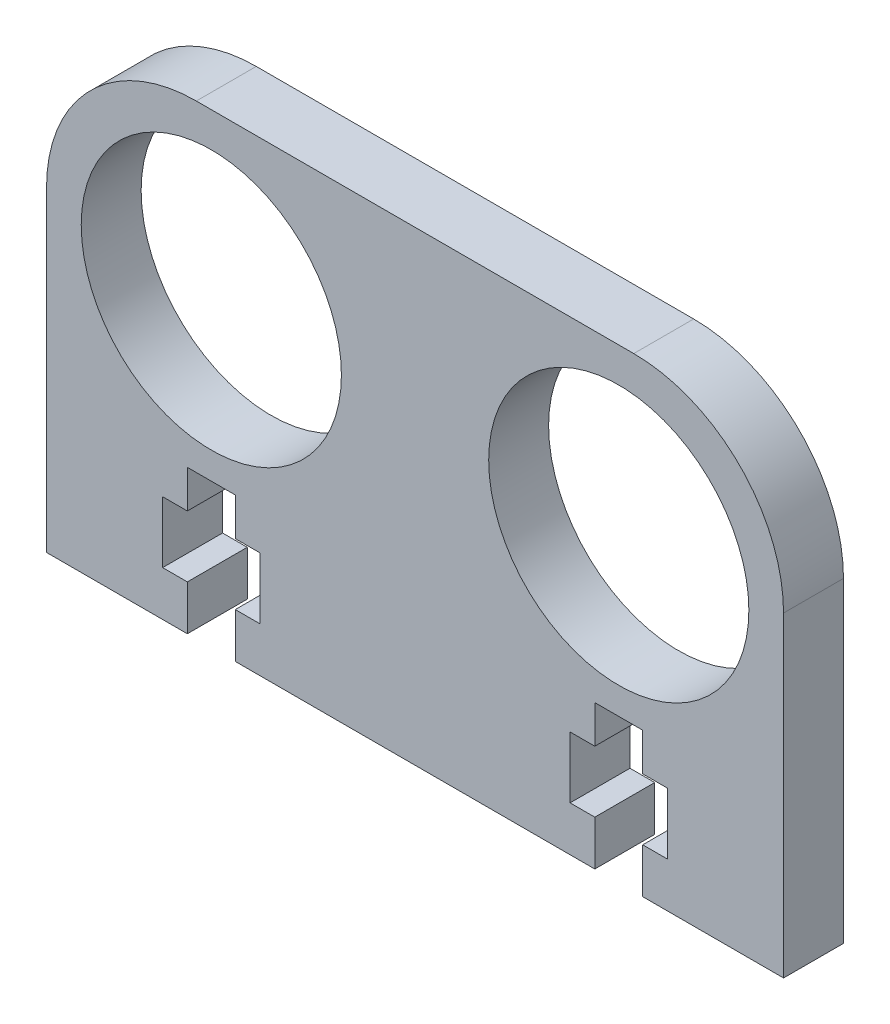
ISO-10303-21;
HEADER;
FILE_DESCRIPTION(('STEP AP214'),'2;1');
FILE_NAME('part.step','',(''),(''),'','','');
FILE_SCHEMA(('AUTOMOTIVE_DESIGN { 1 0 10303 214 1 1 1 1 }'));
ENDSEC;
DATA;
#1=APPLICATION_CONTEXT('core data for automotive mechanical design processes');
#2=APPLICATION_PROTOCOL_DEFINITION('international standard','automotive_design',2000,#1);
#3=PRODUCT_CONTEXT('',#1,'mechanical');
#4=PRODUCT('Part','Part','',(#3));
#5=PRODUCT_RELATED_PRODUCT_CATEGORY('part','',(#4));
#6=PRODUCT_DEFINITION_FORMATION('','',#4);
#7=PRODUCT_DEFINITION_CONTEXT('part definition',#1,'design');
#8=PRODUCT_DEFINITION('design','',#6,#7);
#9=PRODUCT_DEFINITION_SHAPE('','',#8);
#10=(LENGTH_UNIT() NAMED_UNIT(*) SI_UNIT(.MILLI.,.METRE.));
#11=(NAMED_UNIT(*) PLANE_ANGLE_UNIT() SI_UNIT($,.RADIAN.));
#12=(NAMED_UNIT(*) SI_UNIT($,.STERADIAN.) SOLID_ANGLE_UNIT());
#13=UNCERTAINTY_MEASURE_WITH_UNIT(LENGTH_MEASURE(1.E-05),#10,'distance_accuracy_value','');
#14=(GEOMETRIC_REPRESENTATION_CONTEXT(3) GLOBAL_UNCERTAINTY_ASSIGNED_CONTEXT((#13)) GLOBAL_UNIT_ASSIGNED_CONTEXT((#10,
#11,#12)) REPRESENTATION_CONTEXT('',''));
#15=CARTESIAN_POINT('',(0.,0.,0.));
#16=DIRECTION('',(0.,0.,1.));
#17=DIRECTION('',(1.,0.,0.));
#18=AXIS2_PLACEMENT_3D('',#15,#16,#17);
#19=CARTESIAN_POINT('',(0.0400000000000001,11.1479248788774,3.9));
#20=DIRECTION('',(0.,-1.,0.));
#21=DIRECTION('',(1.,0.,0.));
#22=AXIS2_PLACEMENT_3D('',#19,#20,#21);
#23=PLANE('',#22);
#24=DIRECTION('',(-1.,0.,0.));
#25=VECTOR('',#24,1.);
#26=CARTESIAN_POINT('',(0.0400000000000001,11.1479248788774,0.0999999999999999));
#27=LINE('',#26,#25);
#28=CARTESIAN_POINT('',(14.6699999999999,11.1479248788774,0.0999999999999999));
#29=VERTEX_POINT('',#28);
#30=CARTESIAN_POINT('',(-13.0699999999999,11.1479248788774,0.0999999999999999));
#31=VERTEX_POINT('',#30);
#32=EDGE_CURVE('E266',#29,#31,#27,.T.);
#33=ORIENTED_EDGE('',*,*,#32,.T.);
#34=DIRECTION('',(0.,0.,-1.));
#35=VECTOR('',#34,1.);
#36=CARTESIAN_POINT('',(-13.0699999999999,11.1479248788774,3.9));
#37=LINE('',#36,#35);
#38=CARTESIAN_POINT('',(-13.0699999999999,11.1479248788774,3.9));
#39=VERTEX_POINT('',#38);
#40=EDGE_CURVE('E11',#39,#31,#37,.T.);
#41=ORIENTED_EDGE('',*,*,#40,.F.);
#42=DIRECTION('',(-1.,0.,0.));
#43=VECTOR('',#42,1.);
#44=CARTESIAN_POINT('',(0.0400000000000001,11.1479248788774,3.9));
#45=LINE('',#44,#43);
#46=CARTESIAN_POINT('',(14.6699999999999,11.1479248788774,3.9));
#47=VERTEX_POINT('',#46);
#48=EDGE_CURVE('E346',#47,#39,#45,.T.);
#49=ORIENTED_EDGE('',*,*,#48,.F.);
#50=DIRECTION('',(0.,0.,-1.));
#51=VECTOR('',#50,1.);
#52=CARTESIAN_POINT('',(14.6699999999999,11.1479248788774,3.9));
#53=LINE('',#52,#51);
#54=EDGE_CURVE('E52',#47,#29,#53,.T.);
#55=ORIENTED_EDGE('',*,*,#54,.T.);
#56=EDGE_LOOP('',(#33,#41,#49,#55));
#57=FACE_BOUND('',#56,.T.);
#58=ADVANCED_FACE('F36',(#57),#23,.F.);
#59=CARTESIAN_POINT('',(-13.07,1.64792487887737,3.9));
#60=DIRECTION('',(0.,0.,-1.));
#61=DIRECTION('',(-1.,0.,0.));
#62=AXIS2_PLACEMENT_3D('',#59,#60,#61);
#63=CYLINDRICAL_SURFACE('',#62,9.5);
#64=CARTESIAN_POINT('',(-13.07,1.64792487887737,0.0999999999999999));
#65=DIRECTION('',(0.,0.,1.));
#66=DIRECTION('',(1.,0.,0.));
#67=AXIS2_PLACEMENT_3D('',#64,#65,#66);
#68=CIRCLE('',#67,9.5);
#69=CARTESIAN_POINT('',(-22.57,1.64792487887737,0.0999999999999999));
#70=VERTEX_POINT('',#69);
#71=EDGE_CURVE('E268',#31,#70,#68,.T.);
#72=ORIENTED_EDGE('',*,*,#71,.T.);
#73=DIRECTION('',(0.,0.,-1.));
#74=VECTOR('',#73,1.);
#75=CARTESIAN_POINT('',(-22.57,1.64792487887737,3.9));
#76=LINE('',#75,#74);
#77=CARTESIAN_POINT('',(-22.57,1.64792487887737,3.9));
#78=VERTEX_POINT('',#77);
#79=EDGE_CURVE('E44',#78,#70,#76,.T.);
#80=ORIENTED_EDGE('',*,*,#79,.F.);
#81=CARTESIAN_POINT('',(-13.07,1.64792487887737,3.9));
#82=DIRECTION('',(0.,0.,1.));
#83=DIRECTION('',(1.,0.,0.));
#84=AXIS2_PLACEMENT_3D('',#81,#82,#83);
#85=CIRCLE('',#84,9.5);
#86=EDGE_CURVE('E157',#39,#78,#85,.T.);
#87=ORIENTED_EDGE('',*,*,#86,.F.);
#88=ORIENTED_EDGE('',*,*,#40,.T.);
#89=EDGE_LOOP('',(#72,#80,#87,#88));
#90=FACE_BOUND('',#89,.T.);
#91=ADVANCED_FACE('F409',(#90),#63,.T.);
#92=CARTESIAN_POINT('',(-22.57,-0.252075121145337,3.9));
#93=DIRECTION('',(-1.,0.,0.));
#94=DIRECTION('',(0.,-1.,0.));
#95=AXIS2_PLACEMENT_3D('',#92,#93,#94);
#96=PLANE('',#95);
#97=DIRECTION('',(0.,1.,0.));
#98=VECTOR('',#97,1.);
#99=CARTESIAN_POINT('',(-22.57,-0.252075121145337,0.0999999999999999));
#100=LINE('',#99,#98);
#101=CARTESIAN_POINT('',(-22.57,-18.3970751211226,0.0999999999999999));
#102=VERTEX_POINT('',#101);
#103=EDGE_CURVE('E272',#102,#70,#100,.T.);
#104=ORIENTED_EDGE('',*,*,#103,.F.);
#105=DIRECTION('',(0.,0.,-1.));
#106=VECTOR('',#105,1.);
#107=CARTESIAN_POINT('',(-22.57,-18.3970751211226,3.9));
#108=LINE('',#107,#106);
#109=CARTESIAN_POINT('',(-22.57,-18.3970751211226,3.9));
#110=VERTEX_POINT('',#109);
#111=EDGE_CURVE('E402',#110,#102,#108,.T.);
#112=ORIENTED_EDGE('',*,*,#111,.F.);
#113=DIRECTION('',(0.,1.,0.));
#114=VECTOR('',#113,1.);
#115=CARTESIAN_POINT('',(-22.57,-0.252075121145337,3.9));
#116=LINE('',#115,#114);
#117=EDGE_CURVE('E408',#110,#78,#116,.T.);
#118=ORIENTED_EDGE('',*,*,#117,.T.);
#119=ORIENTED_EDGE('',*,*,#79,.T.);
#120=EDGE_LOOP('',(#104,#112,#118,#119));
#121=FACE_BOUND('',#120,.T.);
#122=ADVANCED_FACE('F406',(#121),#96,.T.);
#123=CARTESIAN_POINT('',(0.0400000000000015,-18.3970751211226,3.9));
#124=DIRECTION('',(0.,-1.,0.));
#125=DIRECTION('',(0.,0.,-1.));
#126=AXIS2_PLACEMENT_3D('',#123,#124,#125);
#127=PLANE('',#126);
#128=DIRECTION('',(-1.,0.,0.));
#129=VECTOR('',#128,1.);
#130=CARTESIAN_POINT('',(0.0400000000000015,-18.3970751211226,0.0999999999999999));
#131=LINE('',#130,#129);
#132=CARTESIAN_POINT('',(-13.64,-18.3970751211226,0.0999999999999999));
#133=VERTEX_POINT('',#132);
#134=EDGE_CURVE('E275',#133,#102,#131,.T.);
#135=ORIENTED_EDGE('',*,*,#134,.F.);
#136=DIRECTION('',(0.,0.,-1.));
#137=VECTOR('',#136,1.);
#138=CARTESIAN_POINT('',(-13.64,-18.3970751211226,3.9));
#139=LINE('',#138,#137);
#140=CARTESIAN_POINT('',(-13.64,-18.3970751211226,3.9));
#141=VERTEX_POINT('',#140);
#142=EDGE_CURVE('E400',#141,#133,#139,.T.);
#143=ORIENTED_EDGE('',*,*,#142,.F.);
#144=DIRECTION('',(-1.,0.,0.));
#145=VECTOR('',#144,1.);
#146=CARTESIAN_POINT('',(0.0400000000000015,-18.3970751211226,3.9));
#147=LINE('',#146,#145);
#148=EDGE_CURVE('E419',#141,#110,#147,.T.);
#149=ORIENTED_EDGE('',*,*,#148,.T.);
#150=ORIENTED_EDGE('',*,*,#111,.T.);
#151=EDGE_LOOP('',(#135,#143,#149,#150));
#152=FACE_BOUND('',#151,.T.);
#153=ADVANCED_FACE('F416',(#152),#127,.T.);
#154=CARTESIAN_POINT('',(-13.64,-0.252075121145356,3.9));
#155=DIRECTION('',(1.,0.,0.));
#156=DIRECTION('',(0.,1.,0.));
#157=AXIS2_PLACEMENT_3D('',#154,#155,#156);
#158=PLANE('',#157);
#159=DIRECTION('',(0.,-1.,0.));
#160=VECTOR('',#159,1.);
#161=CARTESIAN_POINT('',(-13.64,-0.252075121145356,0.0999999999999999));
#162=LINE('',#161,#160);
#163=CARTESIAN_POINT('',(-13.64,-15.5470751211226,0.0999999999999999));
#164=VERTEX_POINT('',#163);
#165=EDGE_CURVE('E278',#164,#133,#162,.T.);
#166=ORIENTED_EDGE('',*,*,#165,.F.);
#167=DIRECTION('',(0.,0.,-1.));
#168=VECTOR('',#167,1.);
#169=CARTESIAN_POINT('',(-13.64,-15.5470751211226,3.9));
#170=LINE('',#169,#168);
#171=CARTESIAN_POINT('',(-13.64,-15.5470751211226,3.9));
#172=VERTEX_POINT('',#171);
#173=EDGE_CURVE('E398',#172,#164,#170,.T.);
#174=ORIENTED_EDGE('',*,*,#173,.F.);
#175=DIRECTION('',(0.,-1.,0.));
#176=VECTOR('',#175,1.);
#177=CARTESIAN_POINT('',(-13.64,-0.252075121145356,3.9));
#178=LINE('',#177,#176);
#179=EDGE_CURVE('E423',#172,#141,#178,.T.);
#180=ORIENTED_EDGE('',*,*,#179,.T.);
#181=ORIENTED_EDGE('',*,*,#142,.T.);
#182=EDGE_LOOP('',(#166,#174,#180,#181));
#183=FACE_BOUND('',#182,.T.);
#184=ADVANCED_FACE('F788',(#183),#158,.T.);
#185=CARTESIAN_POINT('',(0.0399999999999693,-15.5470751211227,3.9));
#186=DIRECTION('',(0.,1.,0.));
#187=DIRECTION('',(-1.,0.,0.));
#188=AXIS2_PLACEMENT_3D('',#185,#186,#187);
#189=PLANE('',#188);
#190=DIRECTION('',(1.,0.,0.));
#191=VECTOR('',#190,1.);
#192=CARTESIAN_POINT('',(0.0399999999999693,-15.5470751211227,0.0999999999999999));
#193=LINE('',#192,#191);
#194=CARTESIAN_POINT('',(-15.2075,-15.5470751211226,0.0999999999999999));
#195=VERTEX_POINT('',#194);
#196=EDGE_CURVE('E281',#195,#164,#193,.T.);
#197=ORIENTED_EDGE('',*,*,#196,.F.);
#198=DIRECTION('',(0.,0.,-1.));
#199=VECTOR('',#198,1.);
#200=CARTESIAN_POINT('',(-15.2075,-15.5470751211226,3.9));
#201=LINE('',#200,#199);
#202=CARTESIAN_POINT('',(-15.2075,-15.5470751211226,3.9));
#203=VERTEX_POINT('',#202);
#204=EDGE_CURVE('E396',#203,#195,#201,.T.);
#205=ORIENTED_EDGE('',*,*,#204,.F.);
#206=DIRECTION('',(1.,0.,0.));
#207=VECTOR('',#206,1.);
#208=CARTESIAN_POINT('',(0.0399999999999693,-15.5470751211227,3.9));
#209=LINE('',#208,#207);
#210=EDGE_CURVE('E429',#203,#172,#209,.T.);
#211=ORIENTED_EDGE('',*,*,#210,.T.);
#212=ORIENTED_EDGE('',*,*,#173,.T.);
#213=EDGE_LOOP('',(#197,#205,#211,#212));
#214=FACE_BOUND('',#213,.T.);
#215=ADVANCED_FACE('F778',(#214),#189,.T.);
#216=CARTESIAN_POINT('',(-15.2075,-0.252075121145348,3.9));
#217=DIRECTION('',(-1.,0.,0.));
#218=DIRECTION('',(0.,0.,1.));
#219=AXIS2_PLACEMENT_3D('',#216,#217,#218);
#220=PLANE('',#219);
#221=DIRECTION('',(0.,1.,0.));
#222=VECTOR('',#221,1.);
#223=CARTESIAN_POINT('',(-15.2075,-0.252075121145348,0.0999999999999999));
#224=LINE('',#223,#222);
#225=CARTESIAN_POINT('',(-15.2075,-11.6520751211226,0.0999999999999999));
#226=VERTEX_POINT('',#225);
#227=EDGE_CURVE('E284',#195,#226,#224,.T.);
#228=ORIENTED_EDGE('',*,*,#227,.T.);
#229=DIRECTION('',(0.,0.,-1.));
#230=VECTOR('',#229,1.);
#231=CARTESIAN_POINT('',(-15.2075,-11.6520751211226,3.9));
#232=LINE('',#231,#230);
#233=CARTESIAN_POINT('',(-15.2075,-11.6520751211226,3.9));
#234=VERTEX_POINT('',#233);
#235=EDGE_CURVE('E393',#234,#226,#232,.T.);
#236=ORIENTED_EDGE('',*,*,#235,.F.);
#237=DIRECTION('',(0.,1.,0.));
#238=VECTOR('',#237,1.);
#239=CARTESIAN_POINT('',(-15.2075,-0.252075121145348,3.9));
#240=LINE('',#239,#238);
#241=EDGE_CURVE('E432',#203,#234,#240,.T.);
#242=ORIENTED_EDGE('',*,*,#241,.F.);
#243=ORIENTED_EDGE('',*,*,#204,.T.);
#244=EDGE_LOOP('',(#228,#236,#242,#243));
#245=FACE_BOUND('',#244,.T.);
#246=ADVANCED_FACE('F768',(#245),#220,.F.);
#247=CARTESIAN_POINT('',(0.0400000000000015,-11.6520751211226,3.9));
#248=DIRECTION('',(0.,1.,0.));
#249=DIRECTION('',(0.,0.,1.));
#250=AXIS2_PLACEMENT_3D('',#247,#248,#249);
#251=PLANE('',#250);
#252=DIRECTION('',(1.,0.,0.));
#253=VECTOR('',#252,1.);
#254=CARTESIAN_POINT('',(0.0400000000000015,-11.6520751211226,0.0999999999999999));
#255=LINE('',#254,#253);
#256=CARTESIAN_POINT('',(-13.64,-11.6520751211226,0.0999999999999999));
#257=VERTEX_POINT('',#256);
#258=EDGE_CURVE('E286',#226,#257,#255,.T.);
#259=ORIENTED_EDGE('',*,*,#258,.T.);
#260=DIRECTION('',(0.,0.,-1.));
#261=VECTOR('',#260,1.);
#262=CARTESIAN_POINT('',(-13.64,-11.6520751211226,3.9));
#263=LINE('',#262,#261);
#264=CARTESIAN_POINT('',(-13.64,-11.6520751211226,3.9));
#265=VERTEX_POINT('',#264);
#266=EDGE_CURVE('E390',#265,#257,#263,.T.);
#267=ORIENTED_EDGE('',*,*,#266,.F.);
#268=DIRECTION('',(1.,0.,0.));
#269=VECTOR('',#268,1.);
#270=CARTESIAN_POINT('',(0.0400000000000015,-11.6520751211226,3.9));
#271=LINE('',#270,#269);
#272=EDGE_CURVE('E434',#234,#265,#271,.T.);
#273=ORIENTED_EDGE('',*,*,#272,.F.);
#274=ORIENTED_EDGE('',*,*,#235,.T.);
#275=EDGE_LOOP('',(#259,#267,#273,#274));
#276=FACE_BOUND('',#275,.T.);
#277=ADVANCED_FACE('F758',(#276),#251,.F.);
#278=CARTESIAN_POINT('',(-13.64,-0.252075121145348,3.9));
#279=DIRECTION('',(-1.,0.,0.));
#280=DIRECTION('',(0.,0.,1.));
#281=AXIS2_PLACEMENT_3D('',#278,#279,#280);
#282=PLANE('',#281);
#283=DIRECTION('',(0.,1.,0.));
#284=VECTOR('',#283,1.);
#285=CARTESIAN_POINT('',(-13.64,-0.252075121145348,0.0999999999999999));
#286=LINE('',#285,#284);
#287=CARTESIAN_POINT('',(-13.64,-9.25495877911425,0.0999999999999999));
#288=VERTEX_POINT('',#287);
#289=EDGE_CURVE('E288',#257,#288,#286,.T.);
#290=ORIENTED_EDGE('',*,*,#289,.T.);
#291=DIRECTION('',(0.,0.,-1.));
#292=VECTOR('',#291,1.);
#293=CARTESIAN_POINT('',(-13.64,-9.25495877911425,3.9));
#294=LINE('',#293,#292);
#295=CARTESIAN_POINT('',(-13.64,-9.25495877911425,3.9));
#296=VERTEX_POINT('',#295);
#297=EDGE_CURVE('E387',#296,#288,#294,.T.);
#298=ORIENTED_EDGE('',*,*,#297,.F.);
#299=DIRECTION('',(0.,1.,0.));
#300=VECTOR('',#299,1.);
#301=CARTESIAN_POINT('',(-13.64,-0.252075121145348,3.9));
#302=LINE('',#301,#300);
#303=EDGE_CURVE('E436',#265,#296,#302,.T.);
#304=ORIENTED_EDGE('',*,*,#303,.F.);
#305=ORIENTED_EDGE('',*,*,#266,.T.);
#306=EDGE_LOOP('',(#290,#298,#304,#305));
#307=FACE_BOUND('',#306,.T.);
#308=ADVANCED_FACE('F748',(#307),#282,.F.);
#309=CARTESIAN_POINT('',(0.0400000000000015,-9.25495877911425,3.9));
#310=DIRECTION('',(0.,1.,0.));
#311=DIRECTION('',(0.,0.,1.));
#312=AXIS2_PLACEMENT_3D('',#309,#310,#311);
#313=PLANE('',#312);
#314=DIRECTION('',(1.,0.,0.));
#315=VECTOR('',#314,1.);
#316=CARTESIAN_POINT('',(0.0400000000000015,-9.25495877911425,0.0999999999999999));
#317=LINE('',#316,#315);
#318=CARTESIAN_POINT('',(-10.6,-9.25495877911425,0.0999999999999999));
#319=VERTEX_POINT('',#318);
#320=EDGE_CURVE('E290',#288,#319,#317,.T.);
#321=ORIENTED_EDGE('',*,*,#320,.T.);
#322=DIRECTION('',(0.,0.,-1.));
#323=VECTOR('',#322,1.);
#324=CARTESIAN_POINT('',(-10.6,-9.25495877911425,3.9));
#325=LINE('',#324,#323);
#326=CARTESIAN_POINT('',(-10.6,-9.25495877911425,3.9));
#327=VERTEX_POINT('',#326);
#328=EDGE_CURVE('E385',#327,#319,#325,.T.);
#329=ORIENTED_EDGE('',*,*,#328,.F.);
#330=DIRECTION('',(1.,0.,0.));
#331=VECTOR('',#330,1.);
#332=CARTESIAN_POINT('',(0.0400000000000015,-9.25495877911425,3.9));
#333=LINE('',#332,#331);
#334=EDGE_CURVE('E438',#296,#327,#333,.T.);
#335=ORIENTED_EDGE('',*,*,#334,.F.);
#336=ORIENTED_EDGE('',*,*,#297,.T.);
#337=EDGE_LOOP('',(#321,#329,#335,#336));
#338=FACE_BOUND('',#337,.T.);
#339=ADVANCED_FACE('F738',(#338),#313,.F.);
#340=CARTESIAN_POINT('',(-10.6,-0.252075121145348,3.9));
#341=DIRECTION('',(-1.,0.,0.));
#342=DIRECTION('',(0.,0.,1.));
#343=AXIS2_PLACEMENT_3D('',#340,#341,#342);
#344=PLANE('',#343);
#345=DIRECTION('',(0.,1.,0.));
#346=VECTOR('',#345,1.);
#347=CARTESIAN_POINT('',(-10.6,-0.252075121145348,0.0999999999999999));
#348=LINE('',#347,#346);
#349=CARTESIAN_POINT('',(-10.6,-11.6520751211226,0.0999999999999999));
#350=VERTEX_POINT('',#349);
#351=EDGE_CURVE('E293',#350,#319,#348,.T.);
#352=ORIENTED_EDGE('',*,*,#351,.F.);
#353=DIRECTION('',(0.,0.,-1.));
#354=VECTOR('',#353,1.);
#355=CARTESIAN_POINT('',(-10.6,-11.6520751211226,3.9));
#356=LINE('',#355,#354);
#357=CARTESIAN_POINT('',(-10.6,-11.6520751211226,3.9));
#358=VERTEX_POINT('',#357);
#359=EDGE_CURVE('E383',#358,#350,#356,.T.);
#360=ORIENTED_EDGE('',*,*,#359,.F.);
#361=DIRECTION('',(0.,1.,0.));
#362=VECTOR('',#361,1.);
#363=CARTESIAN_POINT('',(-10.6,-0.252075121145348,3.9));
#364=LINE('',#363,#362);
#365=EDGE_CURVE('E440',#358,#327,#364,.T.);
#366=ORIENTED_EDGE('',*,*,#365,.T.);
#367=ORIENTED_EDGE('',*,*,#328,.T.);
#368=EDGE_LOOP('',(#352,#360,#366,#367));
#369=FACE_BOUND('',#368,.T.);
#370=ADVANCED_FACE('F728',(#369),#344,.T.);
#371=CARTESIAN_POINT('',(0.0400000000000015,-11.6520751211226,3.9));
#372=DIRECTION('',(0.,1.,0.));
#373=DIRECTION('',(0.,0.,1.));
#374=AXIS2_PLACEMENT_3D('',#371,#372,#373);
#375=PLANE('',#374);
#376=DIRECTION('',(1.,0.,0.));
#377=VECTOR('',#376,1.);
#378=CARTESIAN_POINT('',(0.0400000000000015,-11.6520751211226,0.0999999999999999));
#379=LINE('',#378,#377);
#380=CARTESIAN_POINT('',(-9.0325,-11.6520751211226,0.0999999999999999));
#381=VERTEX_POINT('',#380);
#382=EDGE_CURVE('E296',#350,#381,#379,.T.);
#383=ORIENTED_EDGE('',*,*,#382,.T.);
#384=DIRECTION('',(0.,0.,-1.));
#385=VECTOR('',#384,1.);
#386=CARTESIAN_POINT('',(-9.0325,-11.6520751211226,3.9));
#387=LINE('',#386,#385);
#388=CARTESIAN_POINT('',(-9.0325,-11.6520751211226,3.9));
#389=VERTEX_POINT('',#388);
#390=EDGE_CURVE('E381',#389,#381,#387,.T.);
#391=ORIENTED_EDGE('',*,*,#390,.F.);
#392=DIRECTION('',(1.,0.,0.));
#393=VECTOR('',#392,1.);
#394=CARTESIAN_POINT('',(0.0400000000000015,-11.6520751211226,3.9));
#395=LINE('',#394,#393);
#396=EDGE_CURVE('E443',#358,#389,#395,.T.);
#397=ORIENTED_EDGE('',*,*,#396,.F.);
#398=ORIENTED_EDGE('',*,*,#359,.T.);
#399=EDGE_LOOP('',(#383,#391,#397,#398));
#400=FACE_BOUND('',#399,.T.);
#401=ADVANCED_FACE('F718',(#400),#375,.F.);
#402=CARTESIAN_POINT('',(-9.0325,-0.252075121145348,3.9));
#403=DIRECTION('',(-1.,0.,0.));
#404=DIRECTION('',(0.,0.,1.));
#405=AXIS2_PLACEMENT_3D('',#402,#403,#404);
#406=PLANE('',#405);
#407=DIRECTION('',(0.,1.,0.));
#408=VECTOR('',#407,1.);
#409=CARTESIAN_POINT('',(-9.0325,-0.252075121145348,0.0999999999999999));
#410=LINE('',#409,#408);
#411=CARTESIAN_POINT('',(-9.0325,-15.5470751211226,0.0999999999999999));
#412=VERTEX_POINT('',#411);
#413=EDGE_CURVE('E299',#412,#381,#410,.T.);
#414=ORIENTED_EDGE('',*,*,#413,.F.);
#415=DIRECTION('',(0.,0.,-1.));
#416=VECTOR('',#415,1.);
#417=CARTESIAN_POINT('',(-9.0325,-15.5470751211226,3.9));
#418=LINE('',#417,#416);
#419=CARTESIAN_POINT('',(-9.0325,-15.5470751211226,3.9));
#420=VERTEX_POINT('',#419);
#421=EDGE_CURVE('E379',#420,#412,#418,.T.);
#422=ORIENTED_EDGE('',*,*,#421,.F.);
#423=DIRECTION('',(0.,1.,0.));
#424=VECTOR('',#423,1.);
#425=CARTESIAN_POINT('',(-9.0325,-0.252075121145348,3.9));
#426=LINE('',#425,#424);
#427=EDGE_CURVE('E445',#420,#389,#426,.T.);
#428=ORIENTED_EDGE('',*,*,#427,.T.);
#429=ORIENTED_EDGE('',*,*,#390,.T.);
#430=EDGE_LOOP('',(#414,#422,#428,#429));
#431=FACE_BOUND('',#430,.T.);
#432=ADVANCED_FACE('F708',(#431),#406,.T.);
#433=CARTESIAN_POINT('',(0.0400000000000015,-15.5470751211226,3.9));
#434=DIRECTION('',(0.,1.,0.));
#435=DIRECTION('',(0.,0.,1.));
#436=AXIS2_PLACEMENT_3D('',#433,#434,#435);
#437=PLANE('',#436);
#438=DIRECTION('',(1.,0.,0.));
#439=VECTOR('',#438,1.);
#440=CARTESIAN_POINT('',(0.0400000000000015,-15.5470751211226,0.0999999999999999));
#441=LINE('',#440,#439);
#442=CARTESIAN_POINT('',(-10.6,-15.5470751211226,0.0999999999999999));
#443=VERTEX_POINT('',#442);
#444=EDGE_CURVE('E302',#443,#412,#441,.T.);
#445=ORIENTED_EDGE('',*,*,#444,.F.);
#446=DIRECTION('',(0.,0.,-1.));
#447=VECTOR('',#446,1.);
#448=CARTESIAN_POINT('',(-10.6,-15.5470751211226,3.9));
#449=LINE('',#448,#447);
#450=CARTESIAN_POINT('',(-10.6,-15.5470751211226,3.9));
#451=VERTEX_POINT('',#450);
#452=EDGE_CURVE('E377',#451,#443,#449,.T.);
#453=ORIENTED_EDGE('',*,*,#452,.F.);
#454=DIRECTION('',(1.,0.,0.));
#455=VECTOR('',#454,1.);
#456=CARTESIAN_POINT('',(0.0400000000000015,-15.5470751211226,3.9));
#457=LINE('',#456,#455);
#458=EDGE_CURVE('E448',#451,#420,#457,.T.);
#459=ORIENTED_EDGE('',*,*,#458,.T.);
#460=ORIENTED_EDGE('',*,*,#421,.T.);
#461=EDGE_LOOP('',(#445,#453,#459,#460));
#462=FACE_BOUND('',#461,.T.);
#463=ADVANCED_FACE('F697',(#462),#437,.T.);
#464=CARTESIAN_POINT('',(-10.6,-0.252075121145348,3.9));
#465=DIRECTION('',(1.,0.,0.));
#466=DIRECTION('',(0.,0.,-1.));
#467=AXIS2_PLACEMENT_3D('',#464,#465,#466);
#468=PLANE('',#467);
#469=DIRECTION('',(0.,-1.,0.));
#470=VECTOR('',#469,1.);
#471=CARTESIAN_POINT('',(-10.6,-0.252075121145348,0.0999999999999999));
#472=LINE('',#471,#470);
#473=CARTESIAN_POINT('',(-10.6,-18.3970751211226,0.0999999999999999));
#474=VERTEX_POINT('',#473);
#475=EDGE_CURVE('E305',#443,#474,#472,.T.);
#476=ORIENTED_EDGE('',*,*,#475,.T.);
#477=DIRECTION('',(0.,0.,-1.));
#478=VECTOR('',#477,1.);
#479=CARTESIAN_POINT('',(-10.6,-18.3970751211226,3.9));
#480=LINE('',#479,#478);
#481=CARTESIAN_POINT('',(-10.6,-18.3970751211226,3.9));
#482=VERTEX_POINT('',#481);
#483=EDGE_CURVE('E375',#482,#474,#480,.T.);
#484=ORIENTED_EDGE('',*,*,#483,.F.);
#485=DIRECTION('',(0.,-1.,0.));
#486=VECTOR('',#485,1.);
#487=CARTESIAN_POINT('',(-10.6,-0.252075121145348,3.9));
#488=LINE('',#487,#486);
#489=EDGE_CURVE('E451',#451,#482,#488,.T.);
#490=ORIENTED_EDGE('',*,*,#489,.F.);
#491=ORIENTED_EDGE('',*,*,#452,.T.);
#492=EDGE_LOOP('',(#476,#484,#490,#491));
#493=FACE_BOUND('',#492,.T.);
#494=ADVANCED_FACE('F687',(#493),#468,.F.);
#495=CARTESIAN_POINT('',(0.0400000000000015,-18.3970751211226,3.9));
#496=DIRECTION('',(0.,-1.,0.));
#497=DIRECTION('',(0.,0.,-1.));
#498=AXIS2_PLACEMENT_3D('',#495,#496,#497);
#499=PLANE('',#498);
#500=DIRECTION('',(-1.,0.,0.));
#501=VECTOR('',#500,1.);
#502=CARTESIAN_POINT('',(0.0400000000000015,-18.3970751211226,0.0999999999999999));
#503=LINE('',#502,#501);
#504=CARTESIAN_POINT('',(12.1999999999999,-18.3970751211226,0.0999999999999999));
#505=VERTEX_POINT('',#504);
#506=EDGE_CURVE('E308',#505,#474,#503,.T.);
#507=ORIENTED_EDGE('',*,*,#506,.F.);
#508=DIRECTION('',(0.,0.,-1.));
#509=VECTOR('',#508,1.);
#510=CARTESIAN_POINT('',(12.1999999999999,-18.3970751211226,3.9));
#511=LINE('',#510,#509);
#512=CARTESIAN_POINT('',(12.1999999999999,-18.3970751211226,3.9));
#513=VERTEX_POINT('',#512);
#514=EDGE_CURVE('E373',#513,#505,#511,.T.);
#515=ORIENTED_EDGE('',*,*,#514,.F.);
#516=DIRECTION('',(-1.,0.,0.));
#517=VECTOR('',#516,1.);
#518=CARTESIAN_POINT('',(0.0400000000000015,-18.3970751211226,3.9));
#519=LINE('',#518,#517);
#520=EDGE_CURVE('E453',#513,#482,#519,.T.);
#521=ORIENTED_EDGE('',*,*,#520,.T.);
#522=ORIENTED_EDGE('',*,*,#483,.T.);
#523=EDGE_LOOP('',(#507,#515,#521,#522));
#524=FACE_BOUND('',#523,.T.);
#525=ADVANCED_FACE('F676',(#524),#499,.T.);
#526=CARTESIAN_POINT('',(12.2000000000037,-0.252075121147922,3.9));
#527=DIRECTION('',(1.,-2.1164687075785E-13,0.));
#528=DIRECTION('',(2.1164687075785E-13,1.,0.));
#529=AXIS2_PLACEMENT_3D('',#526,#527,#528);
#530=PLANE('',#529);
#531=DIRECTION('',(-2.1164687075785E-13,-1.,0.));
#532=VECTOR('',#531,1.);
#533=CARTESIAN_POINT('',(12.2000000000037,-0.252075121147922,0.0999999999999999));
#534=LINE('',#533,#532);
#535=CARTESIAN_POINT('',(12.1999999999999,-15.5470751211226,0.0999999999999999));
#536=VERTEX_POINT('',#535);
#537=EDGE_CURVE('E311',#536,#505,#534,.T.);
#538=ORIENTED_EDGE('',*,*,#537,.F.);
#539=DIRECTION('',(0.,0.,-1.));
#540=VECTOR('',#539,1.);
#541=CARTESIAN_POINT('',(12.1999999999999,-15.5470751211226,3.9));
#542=LINE('',#541,#540);
#543=CARTESIAN_POINT('',(12.1999999999999,-15.5470751211226,3.9));
#544=VERTEX_POINT('',#543);
#545=EDGE_CURVE('E371',#544,#536,#542,.T.);
#546=ORIENTED_EDGE('',*,*,#545,.F.);
#547=DIRECTION('',(-2.1164687075785E-13,-1.,0.));
#548=VECTOR('',#547,1.);
#549=CARTESIAN_POINT('',(12.2000000000037,-0.252075121147922,3.9));
#550=LINE('',#549,#548);
#551=EDGE_CURVE('E456',#544,#513,#550,.T.);
#552=ORIENTED_EDGE('',*,*,#551,.T.);
#553=ORIENTED_EDGE('',*,*,#514,.T.);
#554=EDGE_LOOP('',(#538,#546,#552,#553));
#555=FACE_BOUND('',#554,.T.);
#556=ADVANCED_FACE('F666',(#555),#530,.T.);
#557=CARTESIAN_POINT('',(0.0400000000000015,-15.5470751211226,3.9));
#558=DIRECTION('',(0.,1.,0.));
#559=DIRECTION('',(0.,0.,1.));
#560=AXIS2_PLACEMENT_3D('',#557,#558,#559);
#561=PLANE('',#560);
#562=DIRECTION('',(1.,0.,0.));
#563=VECTOR('',#562,1.);
#564=CARTESIAN_POINT('',(0.0400000000000015,-15.5470751211226,0.0999999999999999));
#565=LINE('',#564,#563);
#566=CARTESIAN_POINT('',(10.6325,-15.5470751211226,0.0999999999999999));
#567=VERTEX_POINT('',#566);
#568=EDGE_CURVE('E314',#567,#536,#565,.T.);
#569=ORIENTED_EDGE('',*,*,#568,.F.);
#570=DIRECTION('',(0.,0.,-1.));
#571=VECTOR('',#570,1.);
#572=CARTESIAN_POINT('',(10.6325,-15.5470751211226,3.9));
#573=LINE('',#572,#571);
#574=CARTESIAN_POINT('',(10.6325,-15.5470751211226,3.9));
#575=VERTEX_POINT('',#574);
#576=EDGE_CURVE('E369',#575,#567,#573,.T.);
#577=ORIENTED_EDGE('',*,*,#576,.F.);
#578=DIRECTION('',(1.,0.,0.));
#579=VECTOR('',#578,1.);
#580=CARTESIAN_POINT('',(0.0400000000000015,-15.5470751211226,3.9));
#581=LINE('',#580,#579);
#582=EDGE_CURVE('E459',#575,#544,#581,.T.);
#583=ORIENTED_EDGE('',*,*,#582,.T.);
#584=ORIENTED_EDGE('',*,*,#545,.T.);
#585=EDGE_LOOP('',(#569,#577,#583,#584));
#586=FACE_BOUND('',#585,.T.);
#587=ADVANCED_FACE('F656',(#586),#561,.T.);
#588=CARTESIAN_POINT('',(10.6325,-0.252075121145348,3.9));
#589=DIRECTION('',(1.,0.,0.));
#590=DIRECTION('',(0.,0.,-1.));
#591=AXIS2_PLACEMENT_3D('',#588,#589,#590);
#592=PLANE('',#591);
#593=DIRECTION('',(0.,-1.,0.));
#594=VECTOR('',#593,1.);
#595=CARTESIAN_POINT('',(10.6325,-0.252075121145348,0.0999999999999999));
#596=LINE('',#595,#594);
#597=CARTESIAN_POINT('',(10.6325,-11.6520751211226,0.0999999999999999));
#598=VERTEX_POINT('',#597);
#599=EDGE_CURVE('E317',#598,#567,#596,.T.);
#600=ORIENTED_EDGE('',*,*,#599,.F.);
#601=DIRECTION('',(0.,0.,-1.));
#602=VECTOR('',#601,1.);
#603=CARTESIAN_POINT('',(10.6325,-11.6520751211226,3.9));
#604=LINE('',#603,#602);
#605=CARTESIAN_POINT('',(10.6325,-11.6520751211226,3.9));
#606=VERTEX_POINT('',#605);
#607=EDGE_CURVE('E367',#606,#598,#604,.T.);
#608=ORIENTED_EDGE('',*,*,#607,.F.);
#609=DIRECTION('',(0.,-1.,0.));
#610=VECTOR('',#609,1.);
#611=CARTESIAN_POINT('',(10.6325,-0.252075121145348,3.9));
#612=LINE('',#611,#610);
#613=EDGE_CURVE('E462',#606,#575,#612,.T.);
#614=ORIENTED_EDGE('',*,*,#613,.T.);
#615=ORIENTED_EDGE('',*,*,#576,.T.);
#616=EDGE_LOOP('',(#600,#608,#614,#615));
#617=FACE_BOUND('',#616,.T.);
#618=ADVANCED_FACE('F646',(#617),#592,.T.);
#619=CARTESIAN_POINT('',(0.0400000000000015,-11.6520751211226,3.9));
#620=DIRECTION('',(0.,1.,0.));
#621=DIRECTION('',(0.,0.,1.));
#622=AXIS2_PLACEMENT_3D('',#619,#620,#621);
#623=PLANE('',#622);
#624=DIRECTION('',(1.,0.,0.));
#625=VECTOR('',#624,1.);
#626=CARTESIAN_POINT('',(0.0400000000000015,-11.6520751211226,0.0999999999999999));
#627=LINE('',#626,#625);
#628=CARTESIAN_POINT('',(12.2,-11.6520751211226,0.0999999999999999));
#629=VERTEX_POINT('',#628);
#630=EDGE_CURVE('E320',#598,#629,#627,.T.);
#631=ORIENTED_EDGE('',*,*,#630,.T.);
#632=DIRECTION('',(0.,0.,-1.));
#633=VECTOR('',#632,1.);
#634=CARTESIAN_POINT('',(12.2,-11.6520751211226,3.9));
#635=LINE('',#634,#633);
#636=CARTESIAN_POINT('',(12.2,-11.6520751211226,3.9));
#637=VERTEX_POINT('',#636);
#638=EDGE_CURVE('E364',#637,#629,#635,.T.);
#639=ORIENTED_EDGE('',*,*,#638,.F.);
#640=DIRECTION('',(1.,0.,0.));
#641=VECTOR('',#640,1.);
#642=CARTESIAN_POINT('',(0.0400000000000015,-11.6520751211226,3.9));
#643=LINE('',#642,#641);
#644=EDGE_CURVE('E465',#606,#637,#643,.T.);
#645=ORIENTED_EDGE('',*,*,#644,.F.);
#646=ORIENTED_EDGE('',*,*,#607,.T.);
#647=EDGE_LOOP('',(#631,#639,#645,#646));
#648=FACE_BOUND('',#647,.T.);
#649=ADVANCED_FACE('F636',(#648),#623,.F.);
#650=CARTESIAN_POINT('',(12.2,-0.252075121145348,3.9));
#651=DIRECTION('',(-1.,0.,0.));
#652=DIRECTION('',(0.,0.,1.));
#653=AXIS2_PLACEMENT_3D('',#650,#651,#652);
#654=PLANE('',#653);
#655=DIRECTION('',(0.,1.,0.));
#656=VECTOR('',#655,1.);
#657=CARTESIAN_POINT('',(12.2,-0.252075121145348,0.0999999999999999));
#658=LINE('',#657,#656);
#659=CARTESIAN_POINT('',(12.2,-9.25495877911425,0.0999999999999999));
#660=VERTEX_POINT('',#659);
#661=EDGE_CURVE('E322',#629,#660,#658,.T.);
#662=ORIENTED_EDGE('',*,*,#661,.T.);
#663=DIRECTION('',(0.,0.,-1.));
#664=VECTOR('',#663,1.);
#665=CARTESIAN_POINT('',(12.2,-9.25495877911425,3.9));
#666=LINE('',#665,#664);
#667=CARTESIAN_POINT('',(12.2,-9.25495877911425,3.9));
#668=VERTEX_POINT('',#667);
#669=EDGE_CURVE('E361',#668,#660,#666,.T.);
#670=ORIENTED_EDGE('',*,*,#669,.F.);
#671=DIRECTION('',(0.,1.,0.));
#672=VECTOR('',#671,1.);
#673=CARTESIAN_POINT('',(12.2,-0.252075121145348,3.9));
#674=LINE('',#673,#672);
#675=EDGE_CURVE('E467',#637,#668,#674,.T.);
#676=ORIENTED_EDGE('',*,*,#675,.F.);
#677=ORIENTED_EDGE('',*,*,#638,.T.);
#678=EDGE_LOOP('',(#662,#670,#676,#677));
#679=FACE_BOUND('',#678,.T.);
#680=ADVANCED_FACE('F626',(#679),#654,.F.);
#681=CARTESIAN_POINT('',(0.0400000000000015,-9.25495877911425,3.9));
#682=DIRECTION('',(0.,1.,0.));
#683=DIRECTION('',(0.,0.,1.));
#684=AXIS2_PLACEMENT_3D('',#681,#682,#683);
#685=PLANE('',#684);
#686=DIRECTION('',(1.,0.,0.));
#687=VECTOR('',#686,1.);
#688=CARTESIAN_POINT('',(0.0400000000000015,-9.25495877911425,0.0999999999999999));
#689=LINE('',#688,#687);
#690=CARTESIAN_POINT('',(15.24,-9.25495877911425,0.0999999999999999));
#691=VERTEX_POINT('',#690);
#692=EDGE_CURVE('E324',#660,#691,#689,.T.);
#693=ORIENTED_EDGE('',*,*,#692,.T.);
#694=DIRECTION('',(0.,0.,-1.));
#695=VECTOR('',#694,1.);
#696=CARTESIAN_POINT('',(15.24,-9.25495877911425,3.9));
#697=LINE('',#696,#695);
#698=CARTESIAN_POINT('',(15.24,-9.25495877911425,3.9));
#699=VERTEX_POINT('',#698);
#700=EDGE_CURVE('E359',#699,#691,#697,.T.);
#701=ORIENTED_EDGE('',*,*,#700,.F.);
#702=DIRECTION('',(1.,0.,0.));
#703=VECTOR('',#702,1.);
#704=CARTESIAN_POINT('',(0.0400000000000015,-9.25495877911425,3.9));
#705=LINE('',#704,#703);
#706=EDGE_CURVE('E469',#668,#699,#705,.T.);
#707=ORIENTED_EDGE('',*,*,#706,.F.);
#708=ORIENTED_EDGE('',*,*,#669,.T.);
#709=EDGE_LOOP('',(#693,#701,#707,#708));
#710=FACE_BOUND('',#709,.T.);
#711=ADVANCED_FACE('F616',(#710),#685,.F.);
#712=CARTESIAN_POINT('',(15.24,-0.252075121145348,3.9));
#713=DIRECTION('',(-1.,0.,0.));
#714=DIRECTION('',(0.,0.,1.));
#715=AXIS2_PLACEMENT_3D('',#712,#713,#714);
#716=PLANE('',#715);
#717=DIRECTION('',(0.,1.,0.));
#718=VECTOR('',#717,1.);
#719=CARTESIAN_POINT('',(15.24,-0.252075121145348,0.0999999999999999));
#720=LINE('',#719,#718);
#721=CARTESIAN_POINT('',(15.24,-11.6520751211226,0.0999999999999999));
#722=VERTEX_POINT('',#721);
#723=EDGE_CURVE('E327',#722,#691,#720,.T.);
#724=ORIENTED_EDGE('',*,*,#723,.F.);
#725=DIRECTION('',(0.,0.,-1.));
#726=VECTOR('',#725,1.);
#727=CARTESIAN_POINT('',(15.24,-11.6520751211226,3.9));
#728=LINE('',#727,#726);
#729=CARTESIAN_POINT('',(15.24,-11.6520751211226,3.9));
#730=VERTEX_POINT('',#729);
#731=EDGE_CURVE('E357',#730,#722,#728,.T.);
#732=ORIENTED_EDGE('',*,*,#731,.F.);
#733=DIRECTION('',(0.,1.,0.));
#734=VECTOR('',#733,1.);
#735=CARTESIAN_POINT('',(15.24,-0.252075121145348,3.9));
#736=LINE('',#735,#734);
#737=EDGE_CURVE('E471',#730,#699,#736,.T.);
#738=ORIENTED_EDGE('',*,*,#737,.T.);
#739=ORIENTED_EDGE('',*,*,#700,.T.);
#740=EDGE_LOOP('',(#724,#732,#738,#739));
#741=FACE_BOUND('',#740,.T.);
#742=ADVANCED_FACE('F606',(#741),#716,.T.);
#743=CARTESIAN_POINT('',(0.0400000000000015,-11.6520751211226,3.9));
#744=DIRECTION('',(0.,1.,0.));
#745=DIRECTION('',(0.,0.,1.));
#746=AXIS2_PLACEMENT_3D('',#743,#744,#745);
#747=PLANE('',#746);
#748=DIRECTION('',(1.,0.,0.));
#749=VECTOR('',#748,1.);
#750=CARTESIAN_POINT('',(0.0400000000000015,-11.6520751211226,0.0999999999999999));
#751=LINE('',#750,#749);
#752=CARTESIAN_POINT('',(16.8075,-11.6520751211226,0.0999999999999999));
#753=VERTEX_POINT('',#752);
#754=EDGE_CURVE('E330',#722,#753,#751,.T.);
#755=ORIENTED_EDGE('',*,*,#754,.T.);
#756=DIRECTION('',(0.,0.,-1.));
#757=VECTOR('',#756,1.);
#758=CARTESIAN_POINT('',(16.8075,-11.6520751211226,3.9));
#759=LINE('',#758,#757);
#760=CARTESIAN_POINT('',(16.8075,-11.6520751211226,3.9));
#761=VERTEX_POINT('',#760);
#762=EDGE_CURVE('E354',#761,#753,#759,.T.);
#763=ORIENTED_EDGE('',*,*,#762,.F.);
#764=DIRECTION('',(1.,0.,0.));
#765=VECTOR('',#764,1.);
#766=CARTESIAN_POINT('',(0.0400000000000015,-11.6520751211226,3.9));
#767=LINE('',#766,#765);
#768=EDGE_CURVE('E474',#730,#761,#767,.T.);
#769=ORIENTED_EDGE('',*,*,#768,.F.);
#770=ORIENTED_EDGE('',*,*,#731,.T.);
#771=EDGE_LOOP('',(#755,#763,#769,#770));
#772=FACE_BOUND('',#771,.T.);
#773=ADVANCED_FACE('F597',(#772),#747,.F.);
#774=CARTESIAN_POINT('',(16.8075,-0.252075121145348,3.9));
#775=DIRECTION('',(1.,0.,0.));
#776=DIRECTION('',(0.,0.,-1.));
#777=AXIS2_PLACEMENT_3D('',#774,#775,#776);
#778=PLANE('',#777);
#779=DIRECTION('',(0.,-1.,0.));
#780=VECTOR('',#779,1.);
#781=CARTESIAN_POINT('',(16.8075,-0.252075121145348,0.0999999999999999));
#782=LINE('',#781,#780);
#783=CARTESIAN_POINT('',(16.8075,-15.5470751211226,0.0999999999999999));
#784=VERTEX_POINT('',#783);
#785=EDGE_CURVE('E332',#753,#784,#782,.T.);
#786=ORIENTED_EDGE('',*,*,#785,.T.);
#787=DIRECTION('',(0.,0.,-1.));
#788=VECTOR('',#787,1.);
#789=CARTESIAN_POINT('',(16.8075,-15.5470751211226,3.9));
#790=LINE('',#789,#788);
#791=CARTESIAN_POINT('',(16.8075,-15.5470751211226,3.9));
#792=VERTEX_POINT('',#791);
#793=EDGE_CURVE('E352',#792,#784,#790,.T.);
#794=ORIENTED_EDGE('',*,*,#793,.F.);
#795=DIRECTION('',(0.,-1.,0.));
#796=VECTOR('',#795,1.);
#797=CARTESIAN_POINT('',(16.8075,-0.252075121145348,3.9));
#798=LINE('',#797,#796);
#799=EDGE_CURVE('E476',#761,#792,#798,.T.);
#800=ORIENTED_EDGE('',*,*,#799,.F.);
#801=ORIENTED_EDGE('',*,*,#762,.T.);
#802=EDGE_LOOP('',(#786,#794,#800,#801));
#803=FACE_BOUND('',#802,.T.);
#804=ADVANCED_FACE('F489',(#803),#778,.F.);
#805=CARTESIAN_POINT('',(0.0400000000000015,-15.5470751211226,3.9));
#806=DIRECTION('',(0.,1.,0.));
#807=DIRECTION('',(0.,0.,1.));
#808=AXIS2_PLACEMENT_3D('',#805,#806,#807);
#809=PLANE('',#808);
#810=DIRECTION('',(1.,0.,0.));
#811=VECTOR('',#810,1.);
#812=CARTESIAN_POINT('',(0.0400000000000015,-15.5470751211226,0.0999999999999999));
#813=LINE('',#812,#811);
#814=CARTESIAN_POINT('',(15.24,-15.5470751211226,0.0999999999999999));
#815=VERTEX_POINT('',#814);
#816=EDGE_CURVE('E335',#815,#784,#813,.T.);
#817=ORIENTED_EDGE('',*,*,#816,.F.);
#818=DIRECTION('',(0.,0.,-1.));
#819=VECTOR('',#818,1.);
#820=CARTESIAN_POINT('',(15.24,-15.5470751211226,3.9));
#821=LINE('',#820,#819);
#822=CARTESIAN_POINT('',(15.24,-15.5470751211226,3.9));
#823=VERTEX_POINT('',#822);
#824=EDGE_CURVE('E350',#823,#815,#821,.T.);
#825=ORIENTED_EDGE('',*,*,#824,.F.);
#826=DIRECTION('',(1.,0.,0.));
#827=VECTOR('',#826,1.);
#828=CARTESIAN_POINT('',(0.0400000000000015,-15.5470751211226,3.9));
#829=LINE('',#828,#827);
#830=EDGE_CURVE('E478',#823,#792,#829,.T.);
#831=ORIENTED_EDGE('',*,*,#830,.T.);
#832=ORIENTED_EDGE('',*,*,#793,.T.);
#833=EDGE_LOOP('',(#817,#825,#831,#832));
#834=FACE_BOUND('',#833,.T.);
#835=ADVANCED_FACE('F482',(#834),#809,.T.);
#836=CARTESIAN_POINT('',(15.24,-0.252075121145348,3.9));
#837=DIRECTION('',(1.,0.,0.));
#838=DIRECTION('',(0.,0.,-1.));
#839=AXIS2_PLACEMENT_3D('',#836,#837,#838);
#840=PLANE('',#839);
#841=DIRECTION('',(0.,-1.,0.));
#842=VECTOR('',#841,1.);
#843=CARTESIAN_POINT('',(15.24,-0.252075121145348,0.0999999999999999));
#844=LINE('',#843,#842);
#845=CARTESIAN_POINT('',(15.24,-18.3970751211226,0.0999999999999999));
#846=VERTEX_POINT('',#845);
#847=EDGE_CURVE('E338',#815,#846,#844,.T.);
#848=ORIENTED_EDGE('',*,*,#847,.T.);
#849=DIRECTION('',(0.,0.,-1.));
#850=VECTOR('',#849,1.);
#851=CARTESIAN_POINT('',(15.24,-18.3970751211226,3.9));
#852=LINE('',#851,#850);
#853=CARTESIAN_POINT('',(15.24,-18.3970751211226,3.9));
#854=VERTEX_POINT('',#853);
#855=EDGE_CURVE('E258',#854,#846,#852,.T.);
#856=ORIENTED_EDGE('',*,*,#855,.F.);
#857=DIRECTION('',(0.,-1.,0.));
#858=VECTOR('',#857,1.);
#859=CARTESIAN_POINT('',(15.24,-0.252075121145348,3.9));
#860=LINE('',#859,#858);
#861=EDGE_CURVE('E246',#823,#854,#860,.T.);
#862=ORIENTED_EDGE('',*,*,#861,.F.);
#863=ORIENTED_EDGE('',*,*,#824,.T.);
#864=EDGE_LOOP('',(#848,#856,#862,#863));
#865=FACE_BOUND('',#864,.T.);
#866=ADVANCED_FACE('F494',(#865),#840,.F.);
#867=CARTESIAN_POINT('',(0.0400000000000015,-18.3970751211226,3.9));
#868=DIRECTION('',(0.,1.,0.));
#869=DIRECTION('',(0.,0.,1.));
#870=AXIS2_PLACEMENT_3D('',#867,#868,#869);
#871=PLANE('',#870);
#872=DIRECTION('',(1.,0.,0.));
#873=VECTOR('',#872,1.);
#874=CARTESIAN_POINT('',(0.0400000000000015,-18.3970751211226,0.0999999999999999));
#875=LINE('',#874,#873);
#876=CARTESIAN_POINT('',(24.17,-18.3970751211226,0.0999999999999999));
#877=VERTEX_POINT('',#876);
#878=EDGE_CURVE('E255',#846,#877,#875,.T.);
#879=ORIENTED_EDGE('',*,*,#878,.T.);
#880=DIRECTION('',(0.,0.,-1.));
#881=VECTOR('',#880,1.);
#882=CARTESIAN_POINT('',(24.17,-18.3970751211226,3.9));
#883=LINE('',#882,#881);
#884=CARTESIAN_POINT('',(24.17,-18.3970751211226,3.9));
#885=VERTEX_POINT('',#884);
#886=EDGE_CURVE('E252',#885,#877,#883,.T.);
#887=ORIENTED_EDGE('',*,*,#886,.F.);
#888=DIRECTION('',(1.,0.,0.));
#889=VECTOR('',#888,1.);
#890=CARTESIAN_POINT('',(0.0400000000000015,-18.3970751211226,3.9));
#891=LINE('',#890,#889);
#892=EDGE_CURVE('E238',#854,#885,#891,.T.);
#893=ORIENTED_EDGE('',*,*,#892,.F.);
#894=ORIENTED_EDGE('',*,*,#855,.T.);
#895=EDGE_LOOP('',(#879,#887,#893,#894));
#896=FACE_BOUND('',#895,.T.);
#897=ADVANCED_FACE('F253',(#896),#871,.F.);
#898=CARTESIAN_POINT('',(24.17,-0.252075121145348,3.9));
#899=DIRECTION('',(-1.,0.,0.));
#900=DIRECTION('',(0.,0.,1.));
#901=AXIS2_PLACEMENT_3D('',#898,#899,#900);
#902=PLANE('',#901);
#903=DIRECTION('',(0.,1.,0.));
#904=VECTOR('',#903,1.);
#905=CARTESIAN_POINT('',(24.17,-0.252075121145348,0.0999999999999999));
#906=LINE('',#905,#904);
#907=CARTESIAN_POINT('',(24.17,1.64792487887738,0.0999999999999999));
#908=VERTEX_POINT('',#907);
#909=EDGE_CURVE('E341',#877,#908,#906,.T.);
#910=ORIENTED_EDGE('',*,*,#909,.T.);
#911=DIRECTION('',(0.,0.,-1.));
#912=VECTOR('',#911,1.);
#913=CARTESIAN_POINT('',(24.17,1.64792487887738,3.9));
#914=LINE('',#913,#912);
#915=CARTESIAN_POINT('',(24.17,1.64792487887738,3.9));
#916=VERTEX_POINT('',#915);
#917=EDGE_CURVE('E145',#916,#908,#914,.T.);
#918=ORIENTED_EDGE('',*,*,#917,.F.);
#919=DIRECTION('',(0.,1.,0.));
#920=VECTOR('',#919,1.);
#921=CARTESIAN_POINT('',(24.17,-0.252075121145348,3.9));
#922=LINE('',#921,#920);
#923=EDGE_CURVE('E243',#885,#916,#922,.T.);
#924=ORIENTED_EDGE('',*,*,#923,.F.);
#925=ORIENTED_EDGE('',*,*,#886,.T.);
#926=EDGE_LOOP('',(#910,#918,#924,#925));
#927=FACE_BOUND('',#926,.T.);
#928=ADVANCED_FACE('F260',(#927),#902,.F.);
#929=CARTESIAN_POINT('',(14.67,1.64792487887738,3.9));
#930=DIRECTION('',(0.,0.,-1.));
#931=DIRECTION('',(-1.,0.,0.));
#932=AXIS2_PLACEMENT_3D('',#929,#930,#931);
#933=CYLINDRICAL_SURFACE('',#932,9.5);
#934=CARTESIAN_POINT('',(14.67,1.64792487887738,0.0999999999999999));
#935=DIRECTION('',(0.,0.,1.));
#936=DIRECTION('',(1.,0.,0.));
#937=AXIS2_PLACEMENT_3D('',#934,#935,#936);
#938=CIRCLE('',#937,9.5);
#939=EDGE_CURVE('E343',#29,#908,#938,.F.);
#940=ORIENTED_EDGE('',*,*,#939,.F.);
#941=ORIENTED_EDGE('',*,*,#54,.F.);
#942=CARTESIAN_POINT('',(14.67,1.64792487887738,3.9));
#943=DIRECTION('',(0.,0.,1.));
#944=DIRECTION('',(1.,0.,0.));
#945=AXIS2_PLACEMENT_3D('',#942,#943,#944);
#946=CIRCLE('',#945,9.5);
#947=EDGE_CURVE('E261',#47,#916,#946,.F.);
#948=ORIENTED_EDGE('',*,*,#947,.T.);
#949=ORIENTED_EDGE('',*,*,#917,.T.);
#950=EDGE_LOOP('',(#940,#941,#948,#949));
#951=FACE_BOUND('',#950,.T.);
#952=ADVANCED_FACE('F507',(#951),#933,.T.);
#953=CARTESIAN_POINT('',(0.0400000000000015,-0.252075121145348,3.9));
#954=DIRECTION('',(0.,0.,1.));
#955=DIRECTION('',(1.,0.,0.));
#956=AXIS2_PLACEMENT_3D('',#953,#954,#955);
#957=PLANE('',#956);
#958=CARTESIAN_POINT('',(13.72,0.697924878877377,3.9));
#959=DIRECTION('',(0.,0.,1.));
#960=DIRECTION('',(1.,0.,0.));
#961=AXIS2_PLACEMENT_3D('',#958,#959,#960);
#962=CIRCLE('',#961,8.25);
#963=CARTESIAN_POINT('',(21.97,0.697924878877377,3.9));
#964=VERTEX_POINT('',#963);
#965=EDGE_CURVE('E533',#964,#964,#962,.T.);
#966=ORIENTED_EDGE('',*,*,#965,.F.);
#967=EDGE_LOOP('',(#966));
#968=FACE_BOUND('',#967,.T.);
#969=CARTESIAN_POINT('',(-12.12,0.697924878877373,3.9));
#970=DIRECTION('',(0.,0.,1.));
#971=DIRECTION('',(1.,0.,0.));
#972=AXIS2_PLACEMENT_3D('',#969,#970,#971);
#973=CIRCLE('',#972,8.25);
#974=CARTESIAN_POINT('',(-3.87,0.697924878877373,3.9));
#975=VERTEX_POINT('',#974);
#976=EDGE_CURVE('E269',#975,#975,#973,.T.);
#977=ORIENTED_EDGE('',*,*,#976,.F.);
#978=EDGE_LOOP('',(#977));
#979=FACE_BOUND('',#978,.T.);
#980=ORIENTED_EDGE('',*,*,#48,.T.);
#981=ORIENTED_EDGE('',*,*,#86,.T.);
#982=ORIENTED_EDGE('',*,*,#117,.F.);
#983=ORIENTED_EDGE('',*,*,#148,.F.);
#984=ORIENTED_EDGE('',*,*,#179,.F.);
#985=ORIENTED_EDGE('',*,*,#210,.F.);
#986=ORIENTED_EDGE('',*,*,#241,.T.);
#987=ORIENTED_EDGE('',*,*,#272,.T.);
#988=ORIENTED_EDGE('',*,*,#303,.T.);
#989=ORIENTED_EDGE('',*,*,#334,.T.);
#990=ORIENTED_EDGE('',*,*,#365,.F.);
#991=ORIENTED_EDGE('',*,*,#396,.T.);
#992=ORIENTED_EDGE('',*,*,#427,.F.);
#993=ORIENTED_EDGE('',*,*,#458,.F.);
#994=ORIENTED_EDGE('',*,*,#489,.T.);
#995=ORIENTED_EDGE('',*,*,#520,.F.);
#996=ORIENTED_EDGE('',*,*,#551,.F.);
#997=ORIENTED_EDGE('',*,*,#582,.F.);
#998=ORIENTED_EDGE('',*,*,#613,.F.);
#999=ORIENTED_EDGE('',*,*,#644,.T.);
#1000=ORIENTED_EDGE('',*,*,#675,.T.);
#1001=ORIENTED_EDGE('',*,*,#706,.T.);
#1002=ORIENTED_EDGE('',*,*,#737,.F.);
#1003=ORIENTED_EDGE('',*,*,#768,.T.);
#1004=ORIENTED_EDGE('',*,*,#799,.T.);
#1005=ORIENTED_EDGE('',*,*,#830,.F.);
#1006=ORIENTED_EDGE('',*,*,#861,.T.);
#1007=ORIENTED_EDGE('',*,*,#892,.T.);
#1008=ORIENTED_EDGE('',*,*,#923,.T.);
#1009=ORIENTED_EDGE('',*,*,#947,.F.);
#1010=EDGE_LOOP('',(#980,#981,#982,#983,#984,#985,#986,#987,#988,#989,#990,#991,#992,#993,#994,
#995,#996,#997,#998,#999,#1000,#1001,#1002,#1003,#1004,#1005,#1006,#1007,#1008,#1009));
#1011=FACE_BOUND('',#1010,.T.);
#1012=ADVANCED_FACE('F240',(#968,#979,#1011),#957,.T.);
#1013=CARTESIAN_POINT('',(0.0400000000000015,-0.252075121145348,0.0999999999999999));
#1014=DIRECTION('',(0.,0.,1.));
#1015=DIRECTION('',(1.,0.,0.));
#1016=AXIS2_PLACEMENT_3D('',#1013,#1014,#1015);
#1017=PLANE('',#1016);
#1018=CARTESIAN_POINT('',(13.72,0.697924878877377,0.0999999999999999));
#1019=DIRECTION('',(0.,0.,-1.));
#1020=DIRECTION('',(-1.,0.,0.));
#1021=AXIS2_PLACEMENT_3D('',#1018,#1019,#1020);
#1022=CIRCLE('',#1021,8.25);
#1023=CARTESIAN_POINT('',(5.46999999999999,0.697924878877377,0.0999999999999999));
#1024=VERTEX_POINT('',#1023);
#1025=EDGE_CURVE('E536',#1024,#1024,#1022,.T.);
#1026=ORIENTED_EDGE('',*,*,#1025,.F.);
#1027=EDGE_LOOP('',(#1026));
#1028=FACE_BOUND('',#1027,.T.);
#1029=CARTESIAN_POINT('',(-12.12,0.697924878877373,0.0999999999999999));
#1030=DIRECTION('',(0.,0.,-1.));
#1031=DIRECTION('',(-1.,0.,0.));
#1032=AXIS2_PLACEMENT_3D('',#1029,#1030,#1031);
#1033=CIRCLE('',#1032,8.25);
#1034=CARTESIAN_POINT('',(-20.37,0.697924878877373,0.0999999999999999));
#1035=VERTEX_POINT('',#1034);
#1036=EDGE_CURVE('E538',#1035,#1035,#1033,.T.);
#1037=ORIENTED_EDGE('',*,*,#1036,.F.);
#1038=EDGE_LOOP('',(#1037));
#1039=FACE_BOUND('',#1038,.T.);
#1040=ORIENTED_EDGE('',*,*,#32,.F.);
#1041=ORIENTED_EDGE('',*,*,#939,.T.);
#1042=ORIENTED_EDGE('',*,*,#909,.F.);
#1043=ORIENTED_EDGE('',*,*,#878,.F.);
#1044=ORIENTED_EDGE('',*,*,#847,.F.);
#1045=ORIENTED_EDGE('',*,*,#816,.T.);
#1046=ORIENTED_EDGE('',*,*,#785,.F.);
#1047=ORIENTED_EDGE('',*,*,#754,.F.);
#1048=ORIENTED_EDGE('',*,*,#723,.T.);
#1049=ORIENTED_EDGE('',*,*,#692,.F.);
#1050=ORIENTED_EDGE('',*,*,#661,.F.);
#1051=ORIENTED_EDGE('',*,*,#630,.F.);
#1052=ORIENTED_EDGE('',*,*,#599,.T.);
#1053=ORIENTED_EDGE('',*,*,#568,.T.);
#1054=ORIENTED_EDGE('',*,*,#537,.T.);
#1055=ORIENTED_EDGE('',*,*,#506,.T.);
#1056=ORIENTED_EDGE('',*,*,#475,.F.);
#1057=ORIENTED_EDGE('',*,*,#444,.T.);
#1058=ORIENTED_EDGE('',*,*,#413,.T.);
#1059=ORIENTED_EDGE('',*,*,#382,.F.);
#1060=ORIENTED_EDGE('',*,*,#351,.T.);
#1061=ORIENTED_EDGE('',*,*,#320,.F.);
#1062=ORIENTED_EDGE('',*,*,#289,.F.);
#1063=ORIENTED_EDGE('',*,*,#258,.F.);
#1064=ORIENTED_EDGE('',*,*,#227,.F.);
#1065=ORIENTED_EDGE('',*,*,#196,.T.);
#1066=ORIENTED_EDGE('',*,*,#165,.T.);
#1067=ORIENTED_EDGE('',*,*,#134,.T.);
#1068=ORIENTED_EDGE('',*,*,#103,.T.);
#1069=ORIENTED_EDGE('',*,*,#71,.F.);
#1070=EDGE_LOOP('',(#1040,#1041,#1042,#1043,#1044,#1045,#1046,#1047,#1048,#1049,#1050,#1051,
#1052,#1053,#1054,#1055,#1056,#1057,#1058,#1059,#1060,#1061,#1062,#1063,#1064,#1065,#1066,#1067,
#1068,#1069));
#1071=FACE_BOUND('',#1070,.T.);
#1072=ADVANCED_FACE('F412',(#1028,#1039,#1071),#1017,.F.);
#1073=CARTESIAN_POINT('',(-12.12,0.697924878877373,10.1));
#1074=DIRECTION('',(0.,0.,-1.));
#1075=DIRECTION('',(-1.,0.,0.));
#1076=AXIS2_PLACEMENT_3D('',#1073,#1074,#1075);
#1077=CYLINDRICAL_SURFACE('',#1076,8.25);
#1078=ORIENTED_EDGE('',*,*,#976,.T.);
#1079=EDGE_LOOP('',(#1078));
#1080=FACE_BOUND('',#1079,.T.);
#1081=ORIENTED_EDGE('',*,*,#1036,.T.);
#1082=EDGE_LOOP('',(#1081));
#1083=FACE_BOUND('',#1082,.T.);
#1084=ADVANCED_FACE('F519',(#1080,#1083),#1077,.F.);
#1085=CARTESIAN_POINT('',(13.72,0.697924878877377,10.1));
#1086=DIRECTION('',(0.,0.,-1.));
#1087=DIRECTION('',(-1.,0.,0.));
#1088=AXIS2_PLACEMENT_3D('',#1085,#1086,#1087);
#1089=CYLINDRICAL_SURFACE('',#1088,8.25);
#1090=ORIENTED_EDGE('',*,*,#965,.T.);
#1091=EDGE_LOOP('',(#1090));
#1092=FACE_BOUND('',#1091,.T.);
#1093=ORIENTED_EDGE('',*,*,#1025,.T.);
#1094=EDGE_LOOP('',(#1093));
#1095=FACE_BOUND('',#1094,.T.);
#1096=ADVANCED_FACE('F524',(#1092,#1095),#1089,.F.);
#1097=CLOSED_SHELL('',(#58,#91,#122,#153,#184,#215,#246,#277,#308,#339,#370,#401,#432,#463,#494,
#525,#556,#587,#618,#649,#680,#711,#742,#773,#804,#835,#866,#897,#928,#952,#1012,#1072,#1084,#1096));
#1098=MANIFOLD_SOLID_BREP('B2',#1097);
#1099=ADVANCED_BREP_SHAPE_REPRESENTATION('',(#18,#1098),#14);
#1100=SHAPE_DEFINITION_REPRESENTATION(#9,#1099);
ENDSEC;
END-ISO-10303-21;
